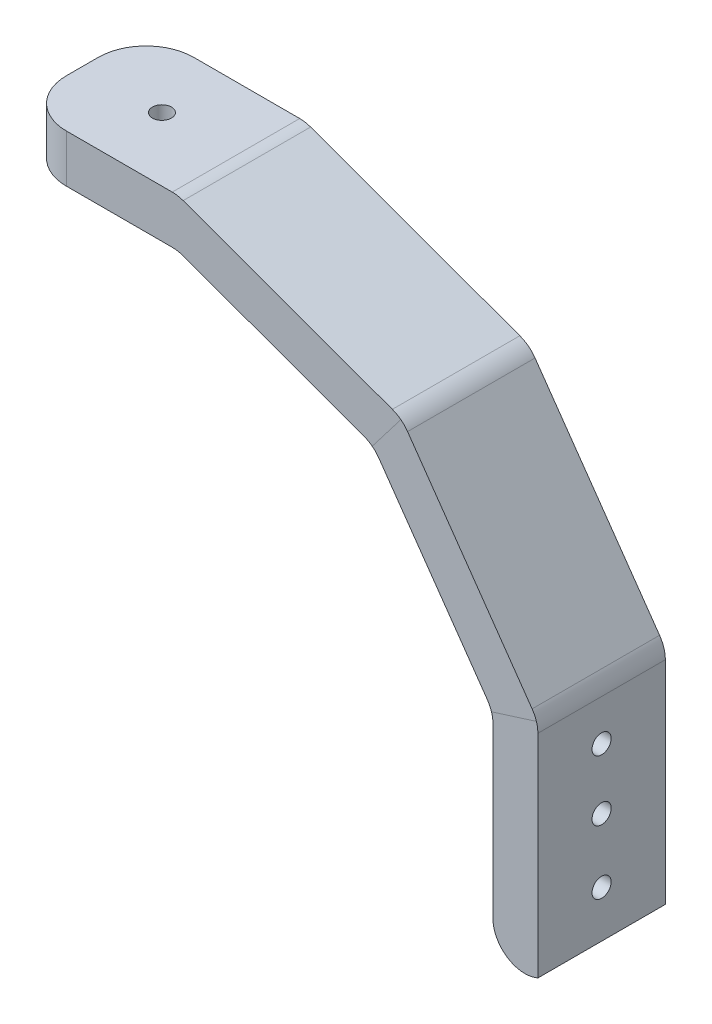
ISO-10303-21;
HEADER;
FILE_DESCRIPTION(('STEP AP214'),'2;1');
FILE_NAME('part.step','',(''),(''),'','','');
FILE_SCHEMA(('AUTOMOTIVE_DESIGN { 1 0 10303 214 1 1 1 1 }'));
ENDSEC;
DATA;
#1=APPLICATION_CONTEXT('core data for automotive mechanical design processes');
#2=APPLICATION_PROTOCOL_DEFINITION('international standard','automotive_design',2000,#1);
#3=PRODUCT_CONTEXT('',#1,'mechanical');
#4=PRODUCT('Part','Part','',(#3));
#5=PRODUCT_RELATED_PRODUCT_CATEGORY('part','',(#4));
#6=PRODUCT_DEFINITION_FORMATION('','',#4);
#7=PRODUCT_DEFINITION_CONTEXT('part definition',#1,'design');
#8=PRODUCT_DEFINITION('design','',#6,#7);
#9=PRODUCT_DEFINITION_SHAPE('','',#8);
#10=(LENGTH_UNIT() NAMED_UNIT(*) SI_UNIT(.MILLI.,.METRE.));
#11=(NAMED_UNIT(*) PLANE_ANGLE_UNIT() SI_UNIT($,.RADIAN.));
#12=(NAMED_UNIT(*) SI_UNIT($,.STERADIAN.) SOLID_ANGLE_UNIT());
#13=UNCERTAINTY_MEASURE_WITH_UNIT(LENGTH_MEASURE(1.E-05),#10,'distance_accuracy_value','');
#14=(GEOMETRIC_REPRESENTATION_CONTEXT(3) GLOBAL_UNCERTAINTY_ASSIGNED_CONTEXT((#13)) GLOBAL_UNIT_ASSIGNED_CONTEXT((#10,
#11,#12)) REPRESENTATION_CONTEXT('',''));
#15=CARTESIAN_POINT('',(0.,0.,0.));
#16=DIRECTION('',(0.,0.,1.));
#17=DIRECTION('',(1.,0.,0.));
#18=AXIS2_PLACEMENT_3D('',#15,#16,#17);
#19=CARTESIAN_POINT('',(0.,15.,0.));
#20=DIRECTION('',(0.,1.,0.));
#21=DIRECTION('',(0.,0.,1.));
#22=AXIS2_PLACEMENT_3D('',#19,#20,#21);
#23=PLANE('',#22);
#24=DIRECTION('',(1.,0.,0.));
#25=VECTOR('',#24,1.);
#26=CARTESIAN_POINT('',(-25.,15.,20.));
#27=LINE('',#26,#25);
#28=CARTESIAN_POINT('',(-10.,15.,20.));
#29=VERTEX_POINT('',#28);
#30=CARTESIAN_POINT('',(23.2367301929154,15.,20.));
#31=VERTEX_POINT('',#30);
#32=EDGE_CURVE('E243',#29,#31,#27,.T.);
#33=ORIENTED_EDGE('',*,*,#32,.T.);
#34=DIRECTION('',(0.,0.,-1.));
#35=VECTOR('',#34,1.);
#36=CARTESIAN_POINT('',(23.2367301929154,15.,0.));
#37=LINE('',#36,#35);
#38=CARTESIAN_POINT('',(23.2367301929154,15.,-20.));
#39=VERTEX_POINT('',#38);
#40=EDGE_CURVE('E297',#31,#39,#37,.T.);
#41=ORIENTED_EDGE('',*,*,#40,.T.);
#42=DIRECTION('',(-1.,0.,0.));
#43=VECTOR('',#42,1.);
#44=CARTESIAN_POINT('',(-25.,15.,-20.));
#45=LINE('',#44,#43);
#46=CARTESIAN_POINT('',(-10.,15.,-20.));
#47=VERTEX_POINT('',#46);
#48=EDGE_CURVE('E237',#39,#47,#45,.T.);
#49=ORIENTED_EDGE('',*,*,#48,.T.);
#50=CARTESIAN_POINT('',(-10.,15.,-5.));
#51=DIRECTION('',(0.,1.,0.));
#52=DIRECTION('',(0.,0.,1.));
#53=AXIS2_PLACEMENT_3D('',#50,#51,#52);
#54=CIRCLE('',#53,15.);
#55=CARTESIAN_POINT('',(-25.,15.,-5.));
#56=VERTEX_POINT('',#55);
#57=EDGE_CURVE('E267',#47,#56,#54,.T.);
#58=ORIENTED_EDGE('',*,*,#57,.T.);
#59=DIRECTION('',(0.,0.,1.));
#60=VECTOR('',#59,1.);
#61=CARTESIAN_POINT('',(-25.,15.,-20.));
#62=LINE('',#61,#60);
#63=CARTESIAN_POINT('',(-25.,15.,5.));
#64=VERTEX_POINT('',#63);
#65=EDGE_CURVE('E239',#56,#64,#62,.T.);
#66=ORIENTED_EDGE('',*,*,#65,.T.);
#67=CARTESIAN_POINT('',(-10.,15.,5.));
#68=DIRECTION('',(0.,1.,0.));
#69=DIRECTION('',(0.,0.,1.));
#70=AXIS2_PLACEMENT_3D('',#67,#68,#69);
#71=CIRCLE('',#70,15.);
#72=EDGE_CURVE('E265',#64,#29,#71,.T.);
#73=ORIENTED_EDGE('',*,*,#72,.T.);
#74=EDGE_LOOP('',(#33,#41,#49,#58,#66,#73));
#75=FACE_BOUND('',#74,.T.);
#76=CARTESIAN_POINT('',(0.,15.,0.));
#77=DIRECTION('',(0.,1.,0.));
#78=DIRECTION('',(0.,0.,1.));
#79=AXIS2_PLACEMENT_3D('',#76,#77,#78);
#80=CIRCLE('',#79,3.);
#81=CARTESIAN_POINT('',(0.,15.,3.));
#82=VERTEX_POINT('',#81);
#83=EDGE_CURVE('E229',#82,#82,#80,.T.);
#84=ORIENTED_EDGE('',*,*,#83,.F.);
#85=EDGE_LOOP('',(#84));
#86=FACE_BOUND('',#85,.T.);
#87=ADVANCED_FACE('F34',(#75,#86),#23,.T.);
#88=CARTESIAN_POINT('',(0.,0.,0.));
#89=DIRECTION('',(0.,1.,0.));
#90=DIRECTION('',(0.,0.,1.));
#91=AXIS2_PLACEMENT_3D('',#88,#89,#90);
#92=PLANE('',#91);
#93=DIRECTION('',(-1.,0.,0.));
#94=VECTOR('',#93,1.);
#95=CARTESIAN_POINT('',(-25.,0.,-20.));
#96=LINE('',#95,#94);
#97=CARTESIAN_POINT('',(23.2367301929154,0.,-20.));
#98=VERTEX_POINT('',#97);
#99=CARTESIAN_POINT('',(-10.,0.,-20.));
#100=VERTEX_POINT('',#99);
#101=EDGE_CURVE('E232',#98,#100,#96,.T.);
#102=ORIENTED_EDGE('',*,*,#101,.F.);
#103=DIRECTION('',(0.,0.,-1.));
#104=VECTOR('',#103,1.);
#105=CARTESIAN_POINT('',(23.2367301929154,0.,0.));
#106=LINE('',#105,#104);
#107=CARTESIAN_POINT('',(23.2367301929154,0.,20.));
#108=VERTEX_POINT('',#107);
#109=EDGE_CURVE('E278',#98,#108,#106,.F.);
#110=ORIENTED_EDGE('',*,*,#109,.T.);
#111=DIRECTION('',(1.,0.,0.));
#112=VECTOR('',#111,1.);
#113=CARTESIAN_POINT('',(-25.,0.,20.));
#114=LINE('',#113,#112);
#115=CARTESIAN_POINT('',(-10.,0.,20.));
#116=VERTEX_POINT('',#115);
#117=EDGE_CURVE('E240',#116,#108,#114,.T.);
#118=ORIENTED_EDGE('',*,*,#117,.F.);
#119=CARTESIAN_POINT('',(-10.,0.,5.));
#120=DIRECTION('',(0.,1.,0.));
#121=DIRECTION('',(0.,0.,1.));
#122=AXIS2_PLACEMENT_3D('',#119,#120,#121);
#123=CIRCLE('',#122,15.);
#124=CARTESIAN_POINT('',(-25.,0.,5.));
#125=VERTEX_POINT('',#124);
#126=EDGE_CURVE('E257',#116,#125,#123,.F.);
#127=ORIENTED_EDGE('',*,*,#126,.T.);
#128=DIRECTION('',(0.,0.,1.));
#129=VECTOR('',#128,1.);
#130=CARTESIAN_POINT('',(-25.,0.,-20.));
#131=LINE('',#130,#129);
#132=CARTESIAN_POINT('',(-25.,0.,-5.));
#133=VERTEX_POINT('',#132);
#134=EDGE_CURVE('E248',#133,#125,#131,.T.);
#135=ORIENTED_EDGE('',*,*,#134,.F.);
#136=CARTESIAN_POINT('',(-10.,0.,-5.));
#137=DIRECTION('',(0.,1.,0.));
#138=DIRECTION('',(0.,0.,1.));
#139=AXIS2_PLACEMENT_3D('',#136,#137,#138);
#140=CIRCLE('',#139,15.);
#141=EDGE_CURVE('E259',#133,#100,#140,.F.);
#142=ORIENTED_EDGE('',*,*,#141,.T.);
#143=EDGE_LOOP('',(#102,#110,#118,#127,#135,#142));
#144=FACE_BOUND('',#143,.T.);
#145=CARTESIAN_POINT('',(0.,0.,0.));
#146=DIRECTION('',(0.,1.,0.));
#147=DIRECTION('',(0.,0.,1.));
#148=AXIS2_PLACEMENT_3D('',#145,#146,#147);
#149=CIRCLE('',#148,3.);
#150=CARTESIAN_POINT('',(0.,0.,3.));
#151=VERTEX_POINT('',#150);
#152=EDGE_CURVE('E233',#151,#151,#149,.T.);
#153=ORIENTED_EDGE('',*,*,#152,.T.);
#154=EDGE_LOOP('',(#153));
#155=FACE_BOUND('',#154,.T.);
#156=ADVANCED_FACE('F435',(#144,#155),#92,.F.);
#157=CARTESIAN_POINT('',(-25.,15.,-20.));
#158=DIRECTION('',(0.,0.,1.));
#159=DIRECTION('',(1.,0.,0.));
#160=AXIS2_PLACEMENT_3D('',#157,#158,#159);
#161=PLANE('',#160);
#162=ORIENTED_EDGE('',*,*,#48,.F.);
#163=CARTESIAN_POINT('',(23.2367301929154,5.,-20.));
#164=DIRECTION('',(0.,0.,1.));
#165=DIRECTION('',(1.,0.,0.));
#166=AXIS2_PLACEMENT_3D('',#163,#164,#165);
#167=CIRCLE('',#166,10.);
#168=CARTESIAN_POINT('',(26.656931626172,14.3969262078591,-20.));
#169=VERTEX_POINT('',#168);
#170=EDGE_CURVE('E302',#39,#169,#167,.F.);
#171=ORIENTED_EDGE('',*,*,#170,.T.);
#172=DIRECTION('',(0.93969262078591,-0.342020143325666,0.));
#173=VECTOR('',#172,1.);
#174=CARTESIAN_POINT('',(25.,15.,-20.));
#175=LINE('',#174,#173);
#176=CARTESIAN_POINT('',(92.314216316397,-9.50037108212458,-20.));
#177=VERTEX_POINT('',#176);
#178=EDGE_CURVE('E384',#169,#177,#175,.T.);
#179=ORIENTED_EDGE('',*,*,#178,.T.);
#180=CARTESIAN_POINT('',(88.8940148831403,-18.8972972899837,-20.));
#181=DIRECTION('',(0.,0.,1.));
#182=DIRECTION('',(1.,0.,0.));
#183=AXIS2_PLACEMENT_3D('',#180,#181,#182);
#184=CIRCLE('',#183,10.);
#185=CARTESIAN_POINT('',(94.9816291732276,-10.9637638870713,-20.));
#186=VERTEX_POINT('',#185);
#187=EDGE_CURVE('E300',#177,#186,#184,.F.);
#188=ORIENTED_EDGE('',*,*,#187,.T.);
#189=DIRECTION('',(-0.608761429008719,-0.793353340291237,0.));
#190=VECTOR('',#189,1.);
#191=CARTESIAN_POINT('',(74.3421951512095,-37.8615979856474,-20.));
#192=LINE('',#191,#190);
#193=CARTESIAN_POINT('',(85.9844845454145,-22.6890710491593,-20.));
#194=VERTEX_POINT('',#193);
#195=EDGE_CURVE('E236',#186,#194,#192,.T.);
#196=ORIENTED_EDGE('',*,*,#195,.T.);
#197=CARTESIAN_POINT('',(79.8968702553273,-30.6226044520717,-20.));
#198=DIRECTION('',(0.,0.,1.));
#199=DIRECTION('',(1.,0.,0.));
#200=AXIS2_PLACEMENT_3D('',#197,#198,#199);
#201=CIRCLE('',#200,10.);
#202=CARTESIAN_POINT('',(83.3170716885839,-21.2256782442126,-20.));
#203=VERTEX_POINT('',#202);
#204=EDGE_CURVE('E340',#194,#203,#201,.T.);
#205=ORIENTED_EDGE('',*,*,#204,.T.);
#206=DIRECTION('',(0.93969262078591,-0.342020143325666,0.));
#207=VECTOR('',#206,1.);
#208=CARTESIAN_POINT('',(25.,0.,-20.));
#209=LINE('',#208,#207);
#210=CARTESIAN_POINT('',(26.656931626172,-0.603073792140904,-20.));
#211=VERTEX_POINT('',#210);
#212=EDGE_CURVE('E387',#211,#203,#209,.T.);
#213=ORIENTED_EDGE('',*,*,#212,.F.);
#214=CARTESIAN_POINT('',(23.2367301929154,-10.,-20.));
#215=DIRECTION('',(0.,0.,1.));
#216=DIRECTION('',(1.,0.,0.));
#217=AXIS2_PLACEMENT_3D('',#214,#215,#216);
#218=CIRCLE('',#217,10.);
#219=EDGE_CURVE('E328',#211,#98,#218,.T.);
#220=ORIENTED_EDGE('',*,*,#219,.T.);
#221=ORIENTED_EDGE('',*,*,#101,.T.);
#222=DIRECTION('',(0.,-1.,0.));
#223=VECTOR('',#222,1.);
#224=CARTESIAN_POINT('',(-10.,15.,-20.));
#225=LINE('',#224,#223);
#226=EDGE_CURVE('E262',#100,#47,#225,.F.);
#227=ORIENTED_EDGE('',*,*,#226,.T.);
#228=EDGE_LOOP('',(#162,#171,#179,#188,#196,#205,#213,#220,#221,#227));
#229=FACE_BOUND('',#228,.T.);
#230=ADVANCED_FACE('F441',(#229),#161,.F.);
#231=CARTESIAN_POINT('',(-25.,15.,-20.));
#232=DIRECTION('',(1.,0.,0.));
#233=DIRECTION('',(0.,0.,-1.));
#234=AXIS2_PLACEMENT_3D('',#231,#232,#233);
#235=PLANE('',#234);
#236=ORIENTED_EDGE('',*,*,#65,.F.);
#237=DIRECTION('',(0.,-1.,0.));
#238=VECTOR('',#237,1.);
#239=CARTESIAN_POINT('',(-25.,15.,-5.));
#240=LINE('',#239,#238);
#241=EDGE_CURVE('E254',#56,#133,#240,.T.);
#242=ORIENTED_EDGE('',*,*,#241,.T.);
#243=ORIENTED_EDGE('',*,*,#134,.T.);
#244=DIRECTION('',(0.,-1.,0.));
#245=VECTOR('',#244,1.);
#246=CARTESIAN_POINT('',(-25.,15.,5.));
#247=LINE('',#246,#245);
#248=EDGE_CURVE('E246',#125,#64,#247,.F.);
#249=ORIENTED_EDGE('',*,*,#248,.T.);
#250=EDGE_LOOP('',(#236,#242,#243,#249));
#251=FACE_BOUND('',#250,.T.);
#252=ADVANCED_FACE('F452',(#251),#235,.F.);
#253=CARTESIAN_POINT('',(-25.,15.,20.));
#254=DIRECTION('',(0.,0.,-1.));
#255=DIRECTION('',(-1.,0.,0.));
#256=AXIS2_PLACEMENT_3D('',#253,#254,#255);
#257=PLANE('',#256);
#258=DIRECTION('',(0.93969262078591,-0.342020143325666,0.));
#259=VECTOR('',#258,1.);
#260=CARTESIAN_POINT('',(25.,15.,20.));
#261=LINE('',#260,#259);
#262=CARTESIAN_POINT('',(26.656931626172,14.3969262078591,20.));
#263=VERTEX_POINT('',#262);
#264=CARTESIAN_POINT('',(92.314216316397,-9.50037108212458,20.));
#265=VERTEX_POINT('',#264);
#266=EDGE_CURVE('E376',#263,#265,#261,.T.);
#267=ORIENTED_EDGE('',*,*,#266,.F.);
#268=CARTESIAN_POINT('',(23.2367301929154,5.,20.));
#269=DIRECTION('',(0.,0.,-1.));
#270=DIRECTION('',(-1.,0.,0.));
#271=AXIS2_PLACEMENT_3D('',#268,#269,#270);
#272=CIRCLE('',#271,10.);
#273=EDGE_CURVE('E311',#263,#31,#272,.F.);
#274=ORIENTED_EDGE('',*,*,#273,.T.);
#275=ORIENTED_EDGE('',*,*,#32,.F.);
#276=DIRECTION('',(0.,-1.,0.));
#277=VECTOR('',#276,1.);
#278=CARTESIAN_POINT('',(-10.,15.,20.));
#279=LINE('',#278,#277);
#280=EDGE_CURVE('E269',#29,#116,#279,.T.);
#281=ORIENTED_EDGE('',*,*,#280,.T.);
#282=ORIENTED_EDGE('',*,*,#117,.T.);
#283=CARTESIAN_POINT('',(23.2367301929154,-10.,20.));
#284=DIRECTION('',(0.,0.,-1.));
#285=DIRECTION('',(-1.,0.,0.));
#286=AXIS2_PLACEMENT_3D('',#283,#284,#285);
#287=CIRCLE('',#286,10.);
#288=CARTESIAN_POINT('',(26.656931626172,-0.603073792140904,20.));
#289=VERTEX_POINT('',#288);
#290=EDGE_CURVE('E330',#108,#289,#287,.T.);
#291=ORIENTED_EDGE('',*,*,#290,.T.);
#292=DIRECTION('',(0.93969262078591,-0.342020143325666,0.));
#293=VECTOR('',#292,1.);
#294=CARTESIAN_POINT('',(25.,0.,20.));
#295=LINE('',#294,#293);
#296=CARTESIAN_POINT('',(83.3170716885839,-21.2256782442126,20.));
#297=VERTEX_POINT('',#296);
#298=EDGE_CURVE('E378',#289,#297,#295,.T.);
#299=ORIENTED_EDGE('',*,*,#298,.T.);
#300=CARTESIAN_POINT('',(79.8968702553273,-30.6226044520717,20.));
#301=DIRECTION('',(0.,0.,-1.));
#302=DIRECTION('',(-1.,0.,0.));
#303=AXIS2_PLACEMENT_3D('',#300,#301,#302);
#304=CIRCLE('',#303,10.);
#305=CARTESIAN_POINT('',(85.9844845454145,-22.6890710491593,20.));
#306=VERTEX_POINT('',#305);
#307=EDGE_CURVE('E332',#297,#306,#304,.T.);
#308=ORIENTED_EDGE('',*,*,#307,.T.);
#309=DIRECTION('',(0.608761429008719,0.793353340291237,0.));
#310=VECTOR('',#309,1.);
#311=CARTESIAN_POINT('',(81.5866388483775,-28.4204551473785,20.));
#312=LINE('',#311,#310);
#313=CARTESIAN_POINT('',(94.9816291732276,-10.9637638870713,20.));
#314=VERTEX_POINT('',#313);
#315=EDGE_CURVE('E381',#306,#314,#312,.T.);
#316=ORIENTED_EDGE('',*,*,#315,.T.);
#317=CARTESIAN_POINT('',(88.8940148831403,-18.8972972899837,20.));
#318=DIRECTION('',(0.,0.,-1.));
#319=DIRECTION('',(-1.,0.,0.));
#320=AXIS2_PLACEMENT_3D('',#317,#318,#319);
#321=CIRCLE('',#320,10.);
#322=EDGE_CURVE('E309',#314,#265,#321,.F.);
#323=ORIENTED_EDGE('',*,*,#322,.T.);
#324=EDGE_LOOP('',(#267,#274,#275,#281,#282,#291,#299,#308,#316,#323));
#325=FACE_BOUND('',#324,.T.);
#326=ADVANCED_FACE('F449',(#325),#257,.F.);
#327=CARTESIAN_POINT('',(0.,15.,0.));
#328=DIRECTION('',(0.,-1.,0.));
#329=DIRECTION('',(0.,0.,-1.));
#330=AXIS2_PLACEMENT_3D('',#327,#328,#329);
#331=CYLINDRICAL_SURFACE('',#330,3.);
#332=ORIENTED_EDGE('',*,*,#83,.T.);
#333=EDGE_LOOP('',(#332));
#334=FACE_BOUND('',#333,.T.);
#335=ORIENTED_EDGE('',*,*,#152,.F.);
#336=EDGE_LOOP('',(#335));
#337=FACE_BOUND('',#336,.T.);
#338=ADVANCED_FACE('F446',(#334,#337),#331,.F.);
#339=CARTESIAN_POINT('',(123.881139343693,-146.347204207968,0.));
#340=DIRECTION('',(0.342020143325667,-0.939692620785909,0.));
#341=DIRECTION('',(0.,0.,-1.));
#342=AXIS2_PLACEMENT_3D('',#339,#340,#341);
#343=PLANE('',#342);
#344=DIRECTION('',(-0.939692620785909,-0.342020143325667,0.));
#345=VECTOR('',#344,1.);
#346=CARTESIAN_POINT('',(137.976528655481,-141.216902058083,20.));
#347=LINE('',#346,#345);
#348=CARTESIAN_POINT('',(137.976528655481,-141.216902058083,20.));
#349=VERTEX_POINT('',#348);
#350=CARTESIAN_POINT('',(137.301340776949,-141.462650348406,20.));
#351=VERTEX_POINT('',#350);
#352=EDGE_CURVE('E198',#349,#351,#347,.T.);
#353=ORIENTED_EDGE('',*,*,#352,.T.);
#354=DIRECTION('',(0.,0.,-1.));
#355=VECTOR('',#354,1.);
#356=CARTESIAN_POINT('',(137.301340776949,-141.462650348406,0.));
#357=LINE('',#356,#355);
#358=CARTESIAN_POINT('',(137.301340776949,-141.462650348406,-20.));
#359=VERTEX_POINT('',#358);
#360=EDGE_CURVE('E208',#351,#359,#357,.T.);
#361=ORIENTED_EDGE('',*,*,#360,.T.);
#362=DIRECTION('',(0.939692620785909,0.342020143325667,0.));
#363=VECTOR('',#362,1.);
#364=CARTESIAN_POINT('',(123.881139343693,-146.347204207968,-20.));
#365=LINE('',#364,#363);
#366=CARTESIAN_POINT('',(137.976528655481,-141.216902058083,-20.));
#367=VERTEX_POINT('',#366);
#368=EDGE_CURVE('E191',#359,#367,#365,.T.);
#369=ORIENTED_EDGE('',*,*,#368,.T.);
#370=DIRECTION('',(0.,0.,1.));
#371=VECTOR('',#370,1.);
#372=CARTESIAN_POINT('',(137.976528655481,-141.216902058083,-20.));
#373=LINE('',#372,#371);
#374=EDGE_CURVE('E205',#367,#349,#373,.T.);
#375=ORIENTED_EDGE('',*,*,#374,.T.);
#376=EDGE_LOOP('',(#353,#361,#369,#375));
#377=FACE_BOUND('',#376,.T.);
#378=ADVANCED_FACE('F204',(#377),#343,.T.);
#379=CARTESIAN_POINT('',(137.976528655481,-70.7395784239783,20.));
#380=DIRECTION('',(0.,0.,1.));
#381=DIRECTION('',(1.,0.,0.));
#382=AXIS2_PLACEMENT_3D('',#379,#380,#381);
#383=PLANE('',#382);
#384=DIRECTION('',(0.,-1.,0.));
#385=VECTOR('',#384,1.);
#386=CARTESIAN_POINT('',(123.881139343693,-75.8698805738633,20.));
#387=LINE('',#386,#385);
#388=CARTESIAN_POINT('',(123.881139343693,-79.1571706112082,20.));
#389=VERTEX_POINT('',#388);
#390=CARTESIAN_POINT('',(123.881139343693,-132.065724140547,20.));
#391=VERTEX_POINT('',#390);
#392=EDGE_CURVE('E224',#389,#391,#387,.T.);
#393=ORIENTED_EDGE('',*,*,#392,.T.);
#394=CARTESIAN_POINT('',(133.881139343693,-132.065724140547,20.));
#395=DIRECTION('',(0.,0.,1.));
#396=DIRECTION('',(1.,0.,0.));
#397=AXIS2_PLACEMENT_3D('',#394,#395,#396);
#398=CIRCLE('',#397,10.);
#399=EDGE_CURVE('E295',#391,#351,#398,.T.);
#400=ORIENTED_EDGE('',*,*,#399,.T.);
#401=ORIENTED_EDGE('',*,*,#352,.F.);
#402=DIRECTION('',(0.,-1.,0.));
#403=VECTOR('',#402,1.);
#404=CARTESIAN_POINT('',(137.976528655481,-70.7395784239783,20.));
#405=LINE('',#404,#403);
#406=CARTESIAN_POINT('',(137.976528655481,-74.7129114324234,20.));
#407=VERTEX_POINT('',#406);
#408=EDGE_CURVE('E212',#407,#349,#405,.T.);
#409=ORIENTED_EDGE('',*,*,#408,.F.);
#410=CARTESIAN_POINT('',(127.976528655481,-74.7129114324234,20.));
#411=DIRECTION('',(0.,0.,1.));
#412=DIRECTION('',(1.,0.,0.));
#413=AXIS2_PLACEMENT_3D('',#410,#411,#412);
#414=CIRCLE('',#413,10.);
#415=CARTESIAN_POINT('',(137.513698162964,-71.7058534373807,20.));
#416=VERTEX_POINT('',#415);
#417=EDGE_CURVE('E293',#407,#416,#414,.T.);
#418=ORIENTED_EDGE('',*,*,#417,.T.);
#419=DIRECTION('',(0.953716950748227,0.300705799504274,0.));
#420=VECTOR('',#419,1.);
#421=CARTESIAN_POINT('',(116.391526897046,-78.365648456019,20.));
#422=LINE('',#421,#420);
#423=CARTESIAN_POINT('',(123.418308851175,-76.1501126161654,20.));
#424=VERTEX_POINT('',#423);
#425=EDGE_CURVE('E56',#424,#416,#422,.T.);
#426=ORIENTED_EDGE('',*,*,#425,.F.);
#427=CARTESIAN_POINT('',(113.881139343693,-79.1571706112082,20.));
#428=DIRECTION('',(0.,0.,1.));
#429=DIRECTION('',(1.,0.,0.));
#430=AXIS2_PLACEMENT_3D('',#427,#428,#429);
#431=CIRCLE('',#430,10.);
#432=EDGE_CURVE('E344',#424,#389,#431,.F.);
#433=ORIENTED_EDGE('',*,*,#432,.T.);
#434=EDGE_LOOP('',(#393,#400,#401,#409,#418,#426,#433));
#435=FACE_BOUND('',#434,.T.);
#436=ADVANCED_FACE('F500',(#435),#383,.T.);
#437=CARTESIAN_POINT('',(123.881139343693,-75.8698805738633,20.));
#438=DIRECTION('',(-1.,0.,0.));
#439=DIRECTION('',(0.,-1.,0.));
#440=AXIS2_PLACEMENT_3D('',#437,#438,#439);
#441=PLANE('',#440);
#442=CARTESIAN_POINT('',(123.881139343693,-126.559923543634,0.));
#443=DIRECTION('',(-1.,0.,0.));
#444=DIRECTION('',(0.,-1.,0.));
#445=AXIS2_PLACEMENT_3D('',#442,#443,#444);
#446=CIRCLE('',#445,3.);
#447=CARTESIAN_POINT('',(123.881139343693,-129.559923543634,0.));
#448=VERTEX_POINT('',#447);
#449=EDGE_CURVE('E213',#448,#448,#446,.T.);
#450=ORIENTED_EDGE('',*,*,#449,.F.);
#451=EDGE_LOOP('',(#450));
#452=FACE_BOUND('',#451,.T.);
#453=CARTESIAN_POINT('',(123.881139343693,-87.5599235436335,0.));
#454=DIRECTION('',(-1.,0.,0.));
#455=DIRECTION('',(0.,-1.,0.));
#456=AXIS2_PLACEMENT_3D('',#453,#454,#455);
#457=CIRCLE('',#456,3.);
#458=CARTESIAN_POINT('',(123.881139343693,-90.5599235436335,0.));
#459=VERTEX_POINT('',#458);
#460=EDGE_CURVE('E216',#459,#459,#457,.T.);
#461=ORIENTED_EDGE('',*,*,#460,.F.);
#462=EDGE_LOOP('',(#461));
#463=FACE_BOUND('',#462,.T.);
#464=CARTESIAN_POINT('',(123.881139343693,-106.559923543634,0.));
#465=DIRECTION('',(-1.,0.,0.));
#466=DIRECTION('',(0.,-1.,0.));
#467=AXIS2_PLACEMENT_3D('',#464,#465,#466);
#468=CIRCLE('',#467,3.);
#469=CARTESIAN_POINT('',(123.881139343693,-109.559923543634,0.));
#470=VERTEX_POINT('',#469);
#471=EDGE_CURVE('E395',#470,#470,#468,.T.);
#472=ORIENTED_EDGE('',*,*,#471,.F.);
#473=EDGE_LOOP('',(#472));
#474=FACE_BOUND('',#473,.T.);
#475=ORIENTED_EDGE('',*,*,#392,.F.);
#476=DIRECTION('',(0.,0.,1.));
#477=VECTOR('',#476,1.);
#478=CARTESIAN_POINT('',(123.881139343693,-79.1571706112082,-20.));
#479=LINE('',#478,#477);
#480=CARTESIAN_POINT('',(123.881139343693,-79.1571706112082,-20.));
#481=VERTEX_POINT('',#480);
#482=EDGE_CURVE('E287',#389,#481,#479,.F.);
#483=ORIENTED_EDGE('',*,*,#482,.T.);
#484=DIRECTION('',(0.,-1.,0.));
#485=VECTOR('',#484,1.);
#486=CARTESIAN_POINT('',(123.881139343693,-75.8698805738633,-20.));
#487=LINE('',#486,#485);
#488=CARTESIAN_POINT('',(123.881139343693,-132.065724140547,-20.));
#489=VERTEX_POINT('',#488);
#490=EDGE_CURVE('E197',#481,#489,#487,.T.);
#491=ORIENTED_EDGE('',*,*,#490,.T.);
#492=DIRECTION('',(0.,0.,-1.));
#493=VECTOR('',#492,1.);
#494=CARTESIAN_POINT('',(123.881139343693,-132.065724140547,20.));
#495=LINE('',#494,#493);
#496=EDGE_CURVE('E285',#489,#391,#495,.F.);
#497=ORIENTED_EDGE('',*,*,#496,.T.);
#498=EDGE_LOOP('',(#475,#483,#491,#497));
#499=FACE_BOUND('',#498,.T.);
#500=ADVANCED_FACE('F503',(#452,#463,#474,#499),#441,.T.);
#501=CARTESIAN_POINT('',(123.881139343693,-75.8698805738633,-20.));
#502=DIRECTION('',(0.,0.,-1.));
#503=DIRECTION('',(-1.,0.,0.));
#504=AXIS2_PLACEMENT_3D('',#501,#502,#503);
#505=PLANE('',#504);
#506=ORIENTED_EDGE('',*,*,#368,.F.);
#507=CARTESIAN_POINT('',(133.881139343693,-132.065724140547,-20.));
#508=DIRECTION('',(0.,0.,-1.));
#509=DIRECTION('',(-1.,0.,0.));
#510=AXIS2_PLACEMENT_3D('',#507,#508,#509);
#511=CIRCLE('',#510,10.);
#512=EDGE_CURVE('E291',#359,#489,#511,.T.);
#513=ORIENTED_EDGE('',*,*,#512,.T.);
#514=ORIENTED_EDGE('',*,*,#490,.F.);
#515=CARTESIAN_POINT('',(113.881139343693,-79.1571706112082,-20.));
#516=DIRECTION('',(0.,0.,-1.));
#517=DIRECTION('',(-1.,0.,0.));
#518=AXIS2_PLACEMENT_3D('',#515,#516,#517);
#519=CIRCLE('',#518,10.);
#520=CARTESIAN_POINT('',(123.418308851175,-76.1501126161654,-20.));
#521=VERTEX_POINT('',#520);
#522=EDGE_CURVE('E42',#481,#521,#519,.F.);
#523=ORIENTED_EDGE('',*,*,#522,.T.);
#524=DIRECTION('',(-0.953716950748227,-0.300705799504274,0.));
#525=VECTOR('',#524,1.);
#526=CARTESIAN_POINT('',(105.042008968519,-81.944137713244,-20.));
#527=LINE('',#526,#525);
#528=CARTESIAN_POINT('',(137.513698162964,-71.7058534373807,-20.));
#529=VERTEX_POINT('',#528);
#530=EDGE_CURVE('E48',#529,#521,#527,.T.);
#531=ORIENTED_EDGE('',*,*,#530,.F.);
#532=CARTESIAN_POINT('',(127.976528655481,-74.7129114324234,-20.));
#533=DIRECTION('',(0.,0.,-1.));
#534=DIRECTION('',(-1.,0.,0.));
#535=AXIS2_PLACEMENT_3D('',#532,#533,#534);
#536=CIRCLE('',#535,10.);
#537=CARTESIAN_POINT('',(137.976528655481,-74.7129114324234,-20.));
#538=VERTEX_POINT('',#537);
#539=EDGE_CURVE('E193',#529,#538,#536,.T.);
#540=ORIENTED_EDGE('',*,*,#539,.T.);
#541=DIRECTION('',(0.,-1.,0.));
#542=VECTOR('',#541,1.);
#543=CARTESIAN_POINT('',(137.976528655481,-70.7395784239783,-20.));
#544=LINE('',#543,#542);
#545=EDGE_CURVE('E188',#538,#367,#544,.T.);
#546=ORIENTED_EDGE('',*,*,#545,.T.);
#547=EDGE_LOOP('',(#506,#513,#514,#523,#531,#540,#546));
#548=FACE_BOUND('',#547,.T.);
#549=ADVANCED_FACE('F190',(#548),#505,.T.);
#550=CARTESIAN_POINT('',(137.976528655481,-70.7395784239783,-20.));
#551=DIRECTION('',(1.,0.,0.));
#552=DIRECTION('',(0.,1.,0.));
#553=AXIS2_PLACEMENT_3D('',#550,#551,#552);
#554=PLANE('',#553);
#555=CARTESIAN_POINT('',(137.976528655481,-126.559923543634,0.));
#556=DIRECTION('',(1.,0.,0.));
#557=DIRECTION('',(0.,1.,0.));
#558=AXIS2_PLACEMENT_3D('',#555,#556,#557);
#559=CIRCLE('',#558,3.);
#560=CARTESIAN_POINT('',(137.976528655481,-123.559923543634,0.));
#561=VERTEX_POINT('',#560);
#562=EDGE_CURVE('E402',#561,#561,#559,.T.);
#563=ORIENTED_EDGE('',*,*,#562,.F.);
#564=EDGE_LOOP('',(#563));
#565=FACE_BOUND('',#564,.T.);
#566=CARTESIAN_POINT('',(137.976528655481,-87.5599235436335,0.));
#567=DIRECTION('',(1.,0.,0.));
#568=DIRECTION('',(0.,1.,0.));
#569=AXIS2_PLACEMENT_3D('',#566,#567,#568);
#570=CIRCLE('',#569,3.);
#571=CARTESIAN_POINT('',(137.976528655481,-84.5599235436335,0.));
#572=VERTEX_POINT('',#571);
#573=EDGE_CURVE('E401',#572,#572,#570,.T.);
#574=ORIENTED_EDGE('',*,*,#573,.F.);
#575=EDGE_LOOP('',(#574));
#576=FACE_BOUND('',#575,.T.);
#577=CARTESIAN_POINT('',(137.976528655481,-106.559923543634,0.));
#578=DIRECTION('',(1.,0.,0.));
#579=DIRECTION('',(0.,1.,0.));
#580=AXIS2_PLACEMENT_3D('',#577,#578,#579);
#581=CIRCLE('',#580,3.);
#582=CARTESIAN_POINT('',(137.976528655481,-103.559923543634,0.));
#583=VERTEX_POINT('',#582);
#584=EDGE_CURVE('E398',#583,#583,#581,.T.);
#585=ORIENTED_EDGE('',*,*,#584,.F.);
#586=EDGE_LOOP('',(#585));
#587=FACE_BOUND('',#586,.T.);
#588=ORIENTED_EDGE('',*,*,#545,.F.);
#589=DIRECTION('',(0.,0.,-1.));
#590=VECTOR('',#589,1.);
#591=CARTESIAN_POINT('',(137.976528655481,-74.7129114324234,-20.));
#592=LINE('',#591,#590);
#593=EDGE_CURVE('E326',#538,#407,#592,.F.);
#594=ORIENTED_EDGE('',*,*,#593,.T.);
#595=ORIENTED_EDGE('',*,*,#408,.T.);
#596=ORIENTED_EDGE('',*,*,#374,.F.);
#597=EDGE_LOOP('',(#588,#594,#595,#596));
#598=FACE_BOUND('',#597,.T.);
#599=ADVANCED_FACE('F210',(#565,#576,#587,#598),#554,.T.);
#600=CARTESIAN_POINT('',(94.8065251386104,-9.90676906996448,-20.));
#601=DIRECTION('',(0.819152044288991,0.573576436351048,0.));
#602=DIRECTION('',(-0.573576436351048,0.819152044288991,0.));
#603=AXIS2_PLACEMENT_3D('',#600,#601,#602);
#604=PLANE('',#603);
#605=DIRECTION('',(0.573576436351048,-0.819152044288991,0.));
#606=VECTOR('',#605,1.);
#607=CARTESIAN_POINT('',(94.8065251386104,-9.90676906996448,-20.));
#608=LINE('',#607,#606);
#609=CARTESIAN_POINT('',(97.0855353260303,-13.1615329264732,-20.));
#610=VERTEX_POINT('',#609);
#611=CARTESIAN_POINT('',(136.168049098371,-68.9771470689129,-20.));
#612=VERTEX_POINT('',#611);
#613=EDGE_CURVE('E228',#610,#612,#608,.T.);
#614=ORIENTED_EDGE('',*,*,#613,.F.);
#615=DIRECTION('',(0.,0.,-1.));
#616=VECTOR('',#615,1.);
#617=CARTESIAN_POINT('',(97.0855353260303,-13.1615329264732,-20.));
#618=LINE('',#617,#616);
#619=CARTESIAN_POINT('',(97.0855353260303,-13.1615329264732,20.));
#620=VERTEX_POINT('',#619);
#621=EDGE_CURVE('E320',#610,#620,#618,.F.);
#622=ORIENTED_EDGE('',*,*,#621,.T.);
#623=DIRECTION('',(0.573576436351048,-0.819152044288991,0.));
#624=VECTOR('',#623,1.);
#625=CARTESIAN_POINT('',(94.8065251386104,-9.90676906996449,20.));
#626=LINE('',#625,#624);
#627=CARTESIAN_POINT('',(136.168049098371,-68.9771470689129,20.));
#628=VERTEX_POINT('',#627);
#629=EDGE_CURVE('E365',#620,#628,#626,.T.);
#630=ORIENTED_EDGE('',*,*,#629,.T.);
#631=DIRECTION('',(0.,0.,-1.));
#632=VECTOR('',#631,1.);
#633=CARTESIAN_POINT('',(136.168049098371,-68.9771470689129,-20.));
#634=LINE('',#633,#632);
#635=EDGE_CURVE('E317',#628,#612,#634,.T.);
#636=ORIENTED_EDGE('',*,*,#635,.T.);
#637=EDGE_LOOP('',(#614,#622,#630,#636));
#638=FACE_BOUND('',#637,.T.);
#639=ADVANCED_FACE('F412',(#638),#604,.T.);
#640=CARTESIAN_POINT('',(86.2028785933446,-22.1940497342994,-20.));
#641=DIRECTION('',(0.,0.,-1.));
#642=DIRECTION('',(-1.,0.,0.));
#643=AXIS2_PLACEMENT_3D('',#640,#641,#642);
#644=PLANE('',#643);
#645=ORIENTED_EDGE('',*,*,#195,.F.);
#646=CARTESIAN_POINT('',(88.8940148831403,-18.8972972899837,-20.));
#647=DIRECTION('',(0.,0.,-1.));
#648=DIRECTION('',(-1.,0.,0.));
#649=AXIS2_PLACEMENT_3D('',#646,#647,#648);
#650=CIRCLE('',#649,10.);
#651=EDGE_CURVE('E315',#186,#610,#650,.T.);
#652=ORIENTED_EDGE('',*,*,#651,.T.);
#653=ORIENTED_EDGE('',*,*,#613,.T.);
#654=CARTESIAN_POINT('',(127.976528655481,-74.7129114324234,-20.));
#655=DIRECTION('',(0.,0.,-1.));
#656=DIRECTION('',(-1.,0.,0.));
#657=AXIS2_PLACEMENT_3D('',#654,#655,#656);
#658=CIRCLE('',#657,10.);
#659=EDGE_CURVE('E313',#612,#529,#658,.T.);
#660=ORIENTED_EDGE('',*,*,#659,.T.);
#661=ORIENTED_EDGE('',*,*,#530,.T.);
#662=CARTESIAN_POINT('',(113.881139343693,-79.1571706112082,-20.));
#663=DIRECTION('',(0.,0.,-1.));
#664=DIRECTION('',(-1.,0.,0.));
#665=AXIS2_PLACEMENT_3D('',#662,#663,#664);
#666=CIRCLE('',#665,10.);
#667=CARTESIAN_POINT('',(122.072659786583,-73.4214062476977,-20.));
#668=VERTEX_POINT('',#667);
#669=EDGE_CURVE('E11',#521,#668,#666,.F.);
#670=ORIENTED_EDGE('',*,*,#669,.T.);
#671=DIRECTION('',(0.573576436351048,-0.819152044288991,0.));
#672=VECTOR('',#671,1.);
#673=CARTESIAN_POINT('',(86.2028785933446,-22.1940497342994,-20.));
#674=LINE('',#673,#672);
#675=CARTESIAN_POINT('',(88.0883906982172,-24.8868400885612,-20.));
#676=VERTEX_POINT('',#675);
#677=EDGE_CURVE('E356',#676,#668,#674,.T.);
#678=ORIENTED_EDGE('',*,*,#677,.F.);
#679=CARTESIAN_POINT('',(79.8968702553273,-30.6226044520717,-20.));
#680=DIRECTION('',(0.,0.,-1.));
#681=DIRECTION('',(-1.,0.,0.));
#682=AXIS2_PLACEMENT_3D('',#679,#680,#681);
#683=CIRCLE('',#682,10.);
#684=EDGE_CURVE('E337',#676,#194,#683,.F.);
#685=ORIENTED_EDGE('',*,*,#684,.T.);
#686=EDGE_LOOP('',(#645,#652,#653,#660,#661,#670,#678,#685));
#687=FACE_BOUND('',#686,.T.);
#688=ADVANCED_FACE('F355',(#687),#644,.T.);
#689=CARTESIAN_POINT('',(86.2028785933446,-22.1940497342994,20.));
#690=DIRECTION('',(-0.819152044288991,-0.573576436351048,0.));
#691=DIRECTION('',(0.573576436351048,-0.819152044288991,0.));
#692=AXIS2_PLACEMENT_3D('',#689,#690,#691);
#693=PLANE('',#692);
#694=DIRECTION('',(0.573576436351048,-0.819152044288991,0.));
#695=VECTOR('',#694,1.);
#696=CARTESIAN_POINT('',(86.2028785933446,-22.1940497342994,20.));
#697=LINE('',#696,#695);
#698=CARTESIAN_POINT('',(88.0883906982172,-24.8868400885612,20.));
#699=VERTEX_POINT('',#698);
#700=CARTESIAN_POINT('',(122.072659786583,-73.4214062476977,20.));
#701=VERTEX_POINT('',#700);
#702=EDGE_CURVE('E363',#699,#701,#697,.T.);
#703=ORIENTED_EDGE('',*,*,#702,.F.);
#704=DIRECTION('',(0.,0.,1.));
#705=VECTOR('',#704,1.);
#706=CARTESIAN_POINT('',(88.0883906982172,-24.8868400885612,-20.));
#707=LINE('',#706,#705);
#708=EDGE_CURVE('E283',#699,#676,#707,.F.);
#709=ORIENTED_EDGE('',*,*,#708,.T.);
#710=ORIENTED_EDGE('',*,*,#677,.T.);
#711=DIRECTION('',(0.,0.,1.));
#712=VECTOR('',#711,1.);
#713=CARTESIAN_POINT('',(122.072659786583,-73.4214062476977,20.));
#714=LINE('',#713,#712);
#715=EDGE_CURVE('E280',#668,#701,#714,.T.);
#716=ORIENTED_EDGE('',*,*,#715,.T.);
#717=EDGE_LOOP('',(#703,#709,#710,#716));
#718=FACE_BOUND('',#717,.T.);
#719=ADVANCED_FACE('F360',(#718),#693,.T.);
#720=CARTESIAN_POINT('',(94.8065251386104,-9.90676906996449,20.));
#721=DIRECTION('',(0.,0.,1.));
#722=DIRECTION('',(1.,0.,0.));
#723=AXIS2_PLACEMENT_3D('',#720,#721,#722);
#724=PLANE('',#723);
#725=ORIENTED_EDGE('',*,*,#629,.F.);
#726=CARTESIAN_POINT('',(88.8940148831403,-18.8972972899837,20.));
#727=DIRECTION('',(0.,0.,1.));
#728=DIRECTION('',(1.,0.,0.));
#729=AXIS2_PLACEMENT_3D('',#726,#727,#728);
#730=CIRCLE('',#729,10.);
#731=EDGE_CURVE('E324',#620,#314,#730,.T.);
#732=ORIENTED_EDGE('',*,*,#731,.T.);
#733=ORIENTED_EDGE('',*,*,#315,.F.);
#734=CARTESIAN_POINT('',(79.8968702553273,-30.6226044520717,20.));
#735=DIRECTION('',(0.,0.,1.));
#736=DIRECTION('',(1.,0.,0.));
#737=AXIS2_PLACEMENT_3D('',#734,#735,#736);
#738=CIRCLE('',#737,10.);
#739=EDGE_CURVE('E335',#306,#699,#738,.F.);
#740=ORIENTED_EDGE('',*,*,#739,.T.);
#741=ORIENTED_EDGE('',*,*,#702,.T.);
#742=CARTESIAN_POINT('',(113.881139343693,-79.1571706112082,20.));
#743=DIRECTION('',(0.,0.,1.));
#744=DIRECTION('',(1.,0.,0.));
#745=AXIS2_PLACEMENT_3D('',#742,#743,#744);
#746=CIRCLE('',#745,10.);
#747=EDGE_CURVE('E342',#701,#424,#746,.F.);
#748=ORIENTED_EDGE('',*,*,#747,.T.);
#749=ORIENTED_EDGE('',*,*,#425,.T.);
#750=CARTESIAN_POINT('',(127.976528655481,-74.7129114324234,20.));
#751=DIRECTION('',(0.,0.,1.));
#752=DIRECTION('',(1.,0.,0.));
#753=AXIS2_PLACEMENT_3D('',#750,#751,#752);
#754=CIRCLE('',#753,10.);
#755=EDGE_CURVE('E322',#416,#628,#754,.T.);
#756=ORIENTED_EDGE('',*,*,#755,.T.);
#757=EDGE_LOOP('',(#725,#732,#733,#740,#741,#748,#749,#756));
#758=FACE_BOUND('',#757,.T.);
#759=ADVANCED_FACE('F493',(#758),#724,.T.);
#760=CARTESIAN_POINT('',(25.,15.,-20.));
#761=DIRECTION('',(0.342020143325666,0.93969262078591,0.));
#762=DIRECTION('',(-0.93969262078591,0.342020143325666,0.));
#763=AXIS2_PLACEMENT_3D('',#760,#761,#762);
#764=PLANE('',#763);
#765=ORIENTED_EDGE('',*,*,#178,.F.);
#766=DIRECTION('',(0.,0.,-1.));
#767=VECTOR('',#766,1.);
#768=CARTESIAN_POINT('',(26.656931626172,14.3969262078591,-20.));
#769=LINE('',#768,#767);
#770=EDGE_CURVE('E307',#169,#263,#769,.F.);
#771=ORIENTED_EDGE('',*,*,#770,.T.);
#772=ORIENTED_EDGE('',*,*,#266,.T.);
#773=DIRECTION('',(0.,0.,-1.));
#774=VECTOR('',#773,1.);
#775=CARTESIAN_POINT('',(92.314216316397,-9.50037108212458,-20.));
#776=LINE('',#775,#774);
#777=EDGE_CURVE('E304',#265,#177,#776,.T.);
#778=ORIENTED_EDGE('',*,*,#777,.T.);
#779=EDGE_LOOP('',(#765,#771,#772,#778));
#780=FACE_BOUND('',#779,.T.);
#781=ADVANCED_FACE('F509',(#780),#764,.T.);
#782=CARTESIAN_POINT('',(25.,0.,20.));
#783=DIRECTION('',(-0.342020143325666,-0.93969262078591,0.));
#784=DIRECTION('',(0.93969262078591,-0.342020143325666,0.));
#785=AXIS2_PLACEMENT_3D('',#782,#783,#784);
#786=PLANE('',#785);
#787=ORIENTED_EDGE('',*,*,#298,.F.);
#788=DIRECTION('',(0.,0.,-1.));
#789=VECTOR('',#788,1.);
#790=CARTESIAN_POINT('',(26.656931626172,-0.603073792140904,20.));
#791=LINE('',#790,#789);
#792=EDGE_CURVE('E275',#289,#211,#791,.T.);
#793=ORIENTED_EDGE('',*,*,#792,.T.);
#794=ORIENTED_EDGE('',*,*,#212,.T.);
#795=DIRECTION('',(0.,0.,1.));
#796=VECTOR('',#795,1.);
#797=CARTESIAN_POINT('',(83.3170716885839,-21.2256782442126,20.));
#798=LINE('',#797,#796);
#799=EDGE_CURVE('E272',#203,#297,#798,.T.);
#800=ORIENTED_EDGE('',*,*,#799,.T.);
#801=EDGE_LOOP('',(#787,#793,#794,#800));
#802=FACE_BOUND('',#801,.T.);
#803=ADVANCED_FACE('F461',(#802),#786,.T.);
#804=CARTESIAN_POINT('',(-10.,15.,-5.));
#805=DIRECTION('',(0.,-1.,0.));
#806=DIRECTION('',(0.,0.,-1.));
#807=AXIS2_PLACEMENT_3D('',#804,#805,#806);
#808=CYLINDRICAL_SURFACE('',#807,15.);
#809=ORIENTED_EDGE('',*,*,#57,.F.);
#810=ORIENTED_EDGE('',*,*,#226,.F.);
#811=ORIENTED_EDGE('',*,*,#141,.F.);
#812=ORIENTED_EDGE('',*,*,#241,.F.);
#813=EDGE_LOOP('',(#809,#810,#811,#812));
#814=FACE_BOUND('',#813,.T.);
#815=ADVANCED_FACE('F429',(#814),#808,.T.);
#816=CARTESIAN_POINT('',(-10.,15.,5.));
#817=DIRECTION('',(0.,-1.,0.));
#818=DIRECTION('',(0.,0.,-1.));
#819=AXIS2_PLACEMENT_3D('',#816,#817,#818);
#820=CYLINDRICAL_SURFACE('',#819,15.);
#821=ORIENTED_EDGE('',*,*,#72,.F.);
#822=ORIENTED_EDGE('',*,*,#248,.F.);
#823=ORIENTED_EDGE('',*,*,#126,.F.);
#824=ORIENTED_EDGE('',*,*,#280,.F.);
#825=EDGE_LOOP('',(#821,#822,#823,#824));
#826=FACE_BOUND('',#825,.T.);
#827=ADVANCED_FACE('F419',(#826),#820,.T.);
#828=CARTESIAN_POINT('',(-25.,-106.559923543634,0.));
#829=DIRECTION('',(1.,0.,0.));
#830=DIRECTION('',(0.,1.,0.));
#831=AXIS2_PLACEMENT_3D('',#828,#829,#830);
#832=CYLINDRICAL_SURFACE('',#831,3.);
#833=ORIENTED_EDGE('',*,*,#471,.T.);
#834=EDGE_LOOP('',(#833));
#835=FACE_BOUND('',#834,.T.);
#836=ORIENTED_EDGE('',*,*,#584,.T.);
#837=EDGE_LOOP('',(#836));
#838=FACE_BOUND('',#837,.T.);
#839=ADVANCED_FACE('F417',(#835,#838),#832,.F.);
#840=CARTESIAN_POINT('',(-25.,-87.5599235436336,0.));
#841=DIRECTION('',(1.,0.,0.));
#842=DIRECTION('',(0.,1.,0.));
#843=AXIS2_PLACEMENT_3D('',#840,#841,#842);
#844=CYLINDRICAL_SURFACE('',#843,3.);
#845=ORIENTED_EDGE('',*,*,#460,.T.);
#846=EDGE_LOOP('',(#845));
#847=FACE_BOUND('',#846,.T.);
#848=ORIENTED_EDGE('',*,*,#573,.T.);
#849=EDGE_LOOP('',(#848));
#850=FACE_BOUND('',#849,.T.);
#851=ADVANCED_FACE('F408',(#847,#850),#844,.F.);
#852=CARTESIAN_POINT('',(-25.,-126.559923543634,0.));
#853=DIRECTION('',(1.,0.,0.));
#854=DIRECTION('',(0.,1.,0.));
#855=AXIS2_PLACEMENT_3D('',#852,#853,#854);
#856=CYLINDRICAL_SURFACE('',#855,3.);
#857=ORIENTED_EDGE('',*,*,#449,.T.);
#858=EDGE_LOOP('',(#857));
#859=FACE_BOUND('',#858,.T.);
#860=ORIENTED_EDGE('',*,*,#562,.T.);
#861=EDGE_LOOP('',(#860));
#862=FACE_BOUND('',#861,.T.);
#863=ADVANCED_FACE('F426',(#859,#862),#856,.F.);
#864=CARTESIAN_POINT('',(23.2367301929154,-10.,20.));
#865=DIRECTION('',(0.,0.,-1.));
#866=DIRECTION('',(-1.,0.,0.));
#867=AXIS2_PLACEMENT_3D('',#864,#865,#866);
#868=CYLINDRICAL_SURFACE('',#867,10.);
#869=ORIENTED_EDGE('',*,*,#290,.F.);
#870=ORIENTED_EDGE('',*,*,#109,.F.);
#871=ORIENTED_EDGE('',*,*,#219,.F.);
#872=ORIENTED_EDGE('',*,*,#792,.F.);
#873=EDGE_LOOP('',(#869,#870,#871,#872));
#874=FACE_BOUND('',#873,.T.);
#875=ADVANCED_FACE('F464',(#874),#868,.F.);
#876=CARTESIAN_POINT('',(79.8968702553273,-30.6226044520717,20.));
#877=DIRECTION('',(0.,0.,-1.));
#878=DIRECTION('',(0.,1.,0.));
#879=AXIS2_PLACEMENT_3D('',#876,#877,#878);
#880=CYLINDRICAL_SURFACE('',#879,10.);
#881=ORIENTED_EDGE('',*,*,#684,.F.);
#882=ORIENTED_EDGE('',*,*,#708,.F.);
#883=ORIENTED_EDGE('',*,*,#739,.F.);
#884=ORIENTED_EDGE('',*,*,#307,.F.);
#885=ORIENTED_EDGE('',*,*,#799,.F.);
#886=ORIENTED_EDGE('',*,*,#204,.F.);
#887=EDGE_LOOP('',(#881,#882,#883,#884,#885,#886));
#888=FACE_BOUND('',#887,.T.);
#889=ADVANCED_FACE('F467',(#888),#880,.F.);
#890=CARTESIAN_POINT('',(113.881139343693,-79.1571706112082,20.));
#891=DIRECTION('',(0.,0.,-1.));
#892=DIRECTION('',(-1.,0.,0.));
#893=AXIS2_PLACEMENT_3D('',#890,#891,#892);
#894=CYLINDRICAL_SURFACE('',#893,10.);
#895=ORIENTED_EDGE('',*,*,#522,.F.);
#896=ORIENTED_EDGE('',*,*,#482,.F.);
#897=ORIENTED_EDGE('',*,*,#432,.F.);
#898=ORIENTED_EDGE('',*,*,#747,.F.);
#899=ORIENTED_EDGE('',*,*,#715,.F.);
#900=ORIENTED_EDGE('',*,*,#669,.F.);
#901=EDGE_LOOP('',(#895,#896,#897,#898,#899,#900));
#902=FACE_BOUND('',#901,.T.);
#903=ADVANCED_FACE('F351',(#902),#894,.F.);
#904=CARTESIAN_POINT('',(133.881139343693,-132.065724140547,0.));
#905=DIRECTION('',(0.,0.,-1.));
#906=DIRECTION('',(0.,1.,0.));
#907=AXIS2_PLACEMENT_3D('',#904,#905,#906);
#908=CYLINDRICAL_SURFACE('',#907,10.);
#909=ORIENTED_EDGE('',*,*,#399,.F.);
#910=ORIENTED_EDGE('',*,*,#496,.F.);
#911=ORIENTED_EDGE('',*,*,#512,.F.);
#912=ORIENTED_EDGE('',*,*,#360,.F.);
#913=EDGE_LOOP('',(#909,#910,#911,#912));
#914=FACE_BOUND('',#913,.T.);
#915=ADVANCED_FACE('F474',(#914),#908,.T.);
#916=CARTESIAN_POINT('',(23.2367301929154,5.,0.));
#917=DIRECTION('',(0.,0.,-1.));
#918=DIRECTION('',(-1.,0.,0.));
#919=AXIS2_PLACEMENT_3D('',#916,#917,#918);
#920=CYLINDRICAL_SURFACE('',#919,10.);
#921=ORIENTED_EDGE('',*,*,#273,.F.);
#922=ORIENTED_EDGE('',*,*,#770,.F.);
#923=ORIENTED_EDGE('',*,*,#170,.F.);
#924=ORIENTED_EDGE('',*,*,#40,.F.);
#925=EDGE_LOOP('',(#921,#922,#923,#924));
#926=FACE_BOUND('',#925,.T.);
#927=ADVANCED_FACE('F477',(#926),#920,.T.);
#928=CARTESIAN_POINT('',(88.8940148831403,-18.8972972899837,-20.));
#929=DIRECTION('',(0.,0.,-1.));
#930=DIRECTION('',(0.,1.,0.));
#931=AXIS2_PLACEMENT_3D('',#928,#929,#930);
#932=CYLINDRICAL_SURFACE('',#931,10.);
#933=ORIENTED_EDGE('',*,*,#731,.F.);
#934=ORIENTED_EDGE('',*,*,#621,.F.);
#935=ORIENTED_EDGE('',*,*,#651,.F.);
#936=ORIENTED_EDGE('',*,*,#187,.F.);
#937=ORIENTED_EDGE('',*,*,#777,.F.);
#938=ORIENTED_EDGE('',*,*,#322,.F.);
#939=EDGE_LOOP('',(#933,#934,#935,#936,#937,#938));
#940=FACE_BOUND('',#939,.T.);
#941=ADVANCED_FACE('F480',(#940),#932,.T.);
#942=CARTESIAN_POINT('',(127.976528655481,-74.7129114324234,-20.));
#943=DIRECTION('',(0.,0.,-1.));
#944=DIRECTION('',(-1.,0.,0.));
#945=AXIS2_PLACEMENT_3D('',#942,#943,#944);
#946=CYLINDRICAL_SURFACE('',#945,10.);
#947=ORIENTED_EDGE('',*,*,#417,.F.);
#948=ORIENTED_EDGE('',*,*,#593,.F.);
#949=ORIENTED_EDGE('',*,*,#539,.F.);
#950=ORIENTED_EDGE('',*,*,#659,.F.);
#951=ORIENTED_EDGE('',*,*,#635,.F.);
#952=ORIENTED_EDGE('',*,*,#755,.F.);
#953=EDGE_LOOP('',(#947,#948,#949,#950,#951,#952));
#954=FACE_BOUND('',#953,.T.);
#955=ADVANCED_FACE('F36',(#954),#946,.T.);
#956=CLOSED_SHELL('',(#87,#156,#230,#252,#326,#338,#378,#436,#500,#549,#599,#639,#688,#719,#759,
#781,#803,#815,#827,#839,#851,#863,#875,#889,#903,#915,#927,#941,#955));
#957=MANIFOLD_SOLID_BREP('B2',#956);
#958=ADVANCED_BREP_SHAPE_REPRESENTATION('',(#18,#957),#14);
#959=SHAPE_DEFINITION_REPRESENTATION(#9,#958);
ENDSEC;
END-ISO-10303-21;
